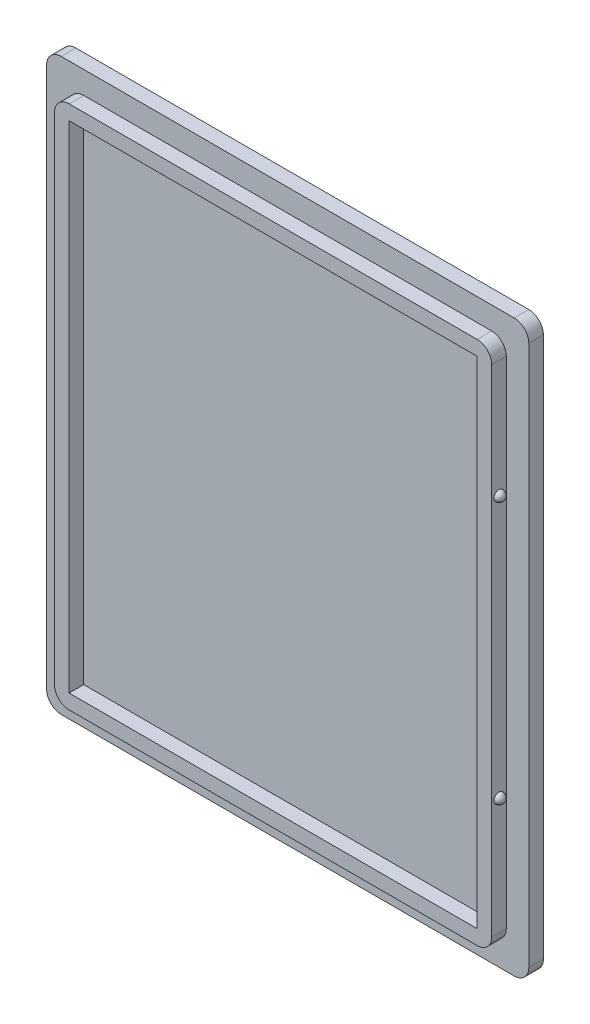
ISO-10303-21;
HEADER;
FILE_DESCRIPTION(('STEP AP214'),'2;1');
FILE_NAME('part.step','',(''),(''),'','','');
FILE_SCHEMA(('AUTOMOTIVE_DESIGN { 1 0 10303 214 1 1 1 1 }'));
ENDSEC;
DATA;
#1=APPLICATION_CONTEXT('core data for automotive mechanical design processes');
#2=APPLICATION_PROTOCOL_DEFINITION('international standard','automotive_design',2000,#1);
#3=PRODUCT_CONTEXT('',#1,'mechanical');
#4=PRODUCT('Part','Part','',(#3));
#5=PRODUCT_RELATED_PRODUCT_CATEGORY('part','',(#4));
#6=PRODUCT_DEFINITION_FORMATION('','',#4);
#7=PRODUCT_DEFINITION_CONTEXT('part definition',#1,'design');
#8=PRODUCT_DEFINITION('design','',#6,#7);
#9=PRODUCT_DEFINITION_SHAPE('','',#8);
#10=(LENGTH_UNIT() NAMED_UNIT(*) SI_UNIT(.MILLI.,.METRE.));
#11=(NAMED_UNIT(*) PLANE_ANGLE_UNIT() SI_UNIT($,.RADIAN.));
#12=(NAMED_UNIT(*) SI_UNIT($,.STERADIAN.) SOLID_ANGLE_UNIT());
#13=UNCERTAINTY_MEASURE_WITH_UNIT(LENGTH_MEASURE(1.E-05),#10,'distance_accuracy_value','');
#14=(GEOMETRIC_REPRESENTATION_CONTEXT(3) GLOBAL_UNCERTAINTY_ASSIGNED_CONTEXT((#13)) GLOBAL_UNIT_ASSIGNED_CONTEXT((#10,
#11,#12)) REPRESENTATION_CONTEXT('',''));
#15=CARTESIAN_POINT('',(0.,0.,0.));
#16=DIRECTION('',(0.,0.,1.));
#17=DIRECTION('',(1.,0.,0.));
#18=AXIS2_PLACEMENT_3D('',#15,#16,#17);
#19=CARTESIAN_POINT('',(0.,0.,1.));
#20=DIRECTION('',(0.,0.,1.));
#21=DIRECTION('',(1.,0.,0.));
#22=AXIS2_PLACEMENT_3D('',#19,#20,#21);
#23=PLANE('',#22);
#24=DIRECTION('',(1.,0.,0.));
#25=VECTOR('',#24,1.);
#26=CARTESIAN_POINT('',(-16.5,-19.5,1.));
#27=LINE('',#26,#25);
#28=CARTESIAN_POINT('',(-15.5,-19.5,1.));
#29=VERTEX_POINT('',#28);
#30=CARTESIAN_POINT('',(15.5,-19.5,1.));
#31=VERTEX_POINT('',#30);
#32=EDGE_CURVE('E277',#29,#31,#27,.T.);
#33=ORIENTED_EDGE('',*,*,#32,.T.);
#34=CARTESIAN_POINT('',(15.5,-18.5,1.));
#35=DIRECTION('',(0.,0.,1.));
#36=DIRECTION('',(1.,0.,0.));
#37=AXIS2_PLACEMENT_3D('',#34,#35,#36);
#38=CIRCLE('',#37,1.);
#39=CARTESIAN_POINT('',(16.5,-18.5,1.));
#40=VERTEX_POINT('',#39);
#41=EDGE_CURVE('E350',#31,#40,#38,.T.);
#42=ORIENTED_EDGE('',*,*,#41,.T.);
#43=DIRECTION('',(0.,1.,0.));
#44=VECTOR('',#43,1.);
#45=CARTESIAN_POINT('',(16.5,-19.5,1.));
#46=LINE('',#45,#44);
#47=CARTESIAN_POINT('',(16.5,18.5,1.));
#48=VERTEX_POINT('',#47);
#49=EDGE_CURVE('E281',#40,#48,#46,.T.);
#50=ORIENTED_EDGE('',*,*,#49,.T.);
#51=CARTESIAN_POINT('',(15.5,18.5,1.));
#52=DIRECTION('',(0.,0.,1.));
#53=DIRECTION('',(1.,0.,0.));
#54=AXIS2_PLACEMENT_3D('',#51,#52,#53);
#55=CIRCLE('',#54,1.);
#56=CARTESIAN_POINT('',(15.5,19.5,1.));
#57=VERTEX_POINT('',#56);
#58=EDGE_CURVE('E341',#48,#57,#55,.T.);
#59=ORIENTED_EDGE('',*,*,#58,.T.);
#60=DIRECTION('',(-1.,0.,0.));
#61=VECTOR('',#60,1.);
#62=CARTESIAN_POINT('',(-16.5,19.5,1.));
#63=LINE('',#62,#61);
#64=CARTESIAN_POINT('',(-15.5,19.5,1.));
#65=VERTEX_POINT('',#64);
#66=EDGE_CURVE('E268',#57,#65,#63,.T.);
#67=ORIENTED_EDGE('',*,*,#66,.T.);
#68=CARTESIAN_POINT('',(-15.5,18.5,1.));
#69=DIRECTION('',(0.,0.,1.));
#70=DIRECTION('',(1.,0.,0.));
#71=AXIS2_PLACEMENT_3D('',#68,#69,#70);
#72=CIRCLE('',#71,1.);
#73=CARTESIAN_POINT('',(-16.5,18.5,1.));
#74=VERTEX_POINT('',#73);
#75=EDGE_CURVE('E344',#65,#74,#72,.T.);
#76=ORIENTED_EDGE('',*,*,#75,.T.);
#77=DIRECTION('',(0.,-1.,0.));
#78=VECTOR('',#77,1.);
#79=CARTESIAN_POINT('',(-16.5,-19.5,1.));
#80=LINE('',#79,#78);
#81=CARTESIAN_POINT('',(-16.5,-18.5,1.));
#82=VERTEX_POINT('',#81);
#83=EDGE_CURVE('E272',#74,#82,#80,.T.);
#84=ORIENTED_EDGE('',*,*,#83,.T.);
#85=CARTESIAN_POINT('',(-15.5,-18.5,1.));
#86=DIRECTION('',(0.,0.,1.));
#87=DIRECTION('',(1.,0.,0.));
#88=AXIS2_PLACEMENT_3D('',#85,#86,#87);
#89=CIRCLE('',#88,1.);
#90=EDGE_CURVE('E347',#82,#29,#89,.T.);
#91=ORIENTED_EDGE('',*,*,#90,.T.);
#92=EDGE_LOOP('',(#33,#42,#50,#59,#67,#76,#84,#91));
#93=FACE_BOUND('',#92,.T.);
#94=DIRECTION('',(0.,-1.,0.));
#95=VECTOR('',#94,1.);
#96=CARTESIAN_POINT('',(-14.96,17.96,1.));
#97=LINE('',#96,#95);
#98=CARTESIAN_POINT('',(-14.96,16.96,1.));
#99=VERTEX_POINT('',#98);
#100=CARTESIAN_POINT('',(-14.96,-16.96,1.));
#101=VERTEX_POINT('',#100);
#102=EDGE_CURVE('E258',#99,#101,#97,.T.);
#103=ORIENTED_EDGE('',*,*,#102,.F.);
#104=CARTESIAN_POINT('',(-13.96,16.96,1.));
#105=DIRECTION('',(0.,0.,1.));
#106=DIRECTION('',(1.,0.,0.));
#107=AXIS2_PLACEMENT_3D('',#104,#105,#106);
#108=CIRCLE('',#107,1.);
#109=CARTESIAN_POINT('',(-13.96,17.96,1.));
#110=VERTEX_POINT('',#109);
#111=EDGE_CURVE('E409',#99,#110,#108,.F.);
#112=ORIENTED_EDGE('',*,*,#111,.T.);
#113=DIRECTION('',(-1.,0.,0.));
#114=VECTOR('',#113,1.);
#115=CARTESIAN_POINT('',(-14.96,17.96,1.));
#116=LINE('',#115,#114);
#117=CARTESIAN_POINT('',(13.96,17.96,1.));
#118=VERTEX_POINT('',#117);
#119=EDGE_CURVE('E204',#118,#110,#116,.T.);
#120=ORIENTED_EDGE('',*,*,#119,.F.);
#121=CARTESIAN_POINT('',(13.96,16.96,1.));
#122=DIRECTION('',(0.,0.,1.));
#123=DIRECTION('',(1.,0.,0.));
#124=AXIS2_PLACEMENT_3D('',#121,#122,#123);
#125=CIRCLE('',#124,1.);
#126=CARTESIAN_POINT('',(14.96,16.96,1.));
#127=VERTEX_POINT('',#126);
#128=EDGE_CURVE('E406',#118,#127,#125,.F.);
#129=ORIENTED_EDGE('',*,*,#128,.T.);
#130=DIRECTION('',(0.,1.,0.));
#131=VECTOR('',#130,1.);
#132=CARTESIAN_POINT('',(14.96,17.96,1.));
#133=LINE('',#132,#131);
#134=CARTESIAN_POINT('',(14.96,-16.96,1.));
#135=VERTEX_POINT('',#134);
#136=EDGE_CURVE('E242',#135,#127,#133,.T.);
#137=ORIENTED_EDGE('',*,*,#136,.F.);
#138=CARTESIAN_POINT('',(13.96,-16.96,1.));
#139=DIRECTION('',(0.,0.,1.));
#140=DIRECTION('',(1.,0.,0.));
#141=AXIS2_PLACEMENT_3D('',#138,#139,#140);
#142=CIRCLE('',#141,1.);
#143=CARTESIAN_POINT('',(13.96,-17.96,1.));
#144=VERTEX_POINT('',#143);
#145=EDGE_CURVE('E11',#135,#144,#142,.F.);
#146=ORIENTED_EDGE('',*,*,#145,.T.);
#147=DIRECTION('',(1.,0.,0.));
#148=VECTOR('',#147,1.);
#149=CARTESIAN_POINT('',(-14.96,-17.96,1.));
#150=LINE('',#149,#148);
#151=CARTESIAN_POINT('',(-13.96,-17.96,1.));
#152=VERTEX_POINT('',#151);
#153=EDGE_CURVE('E262',#152,#144,#150,.T.);
#154=ORIENTED_EDGE('',*,*,#153,.F.);
#155=CARTESIAN_POINT('',(-13.96,-16.96,1.));
#156=DIRECTION('',(0.,0.,1.));
#157=DIRECTION('',(1.,0.,0.));
#158=AXIS2_PLACEMENT_3D('',#155,#156,#157);
#159=CIRCLE('',#158,1.);
#160=EDGE_CURVE('E54',#152,#101,#159,.F.);
#161=ORIENTED_EDGE('',*,*,#160,.T.);
#162=EDGE_LOOP('',(#103,#112,#120,#129,#137,#146,#154,#161));
#163=FACE_BOUND('',#162,.T.);
#164=ADVANCED_FACE('F45',(#93,#163),#23,.T.);
#165=CARTESIAN_POINT('',(-16.5,19.5,1.));
#166=DIRECTION('',(0.,-1.,0.));
#167=DIRECTION('',(1.,0.,0.));
#168=AXIS2_PLACEMENT_3D('',#165,#166,#167);
#169=PLANE('',#168);
#170=DIRECTION('',(-1.,0.,0.));
#171=VECTOR('',#170,1.);
#172=CARTESIAN_POINT('',(-16.5,19.5,0.));
#173=LINE('',#172,#171);
#174=CARTESIAN_POINT('',(15.5,19.5,0.));
#175=VERTEX_POINT('',#174);
#176=CARTESIAN_POINT('',(-15.5,19.5,0.));
#177=VERTEX_POINT('',#176);
#178=EDGE_CURVE('E254',#175,#177,#173,.T.);
#179=ORIENTED_EDGE('',*,*,#178,.T.);
#180=DIRECTION('',(0.,0.,-1.));
#181=VECTOR('',#180,1.);
#182=CARTESIAN_POINT('',(-15.5,19.5,1.));
#183=LINE('',#182,#181);
#184=EDGE_CURVE('E364',#177,#65,#183,.F.);
#185=ORIENTED_EDGE('',*,*,#184,.T.);
#186=ORIENTED_EDGE('',*,*,#66,.F.);
#187=DIRECTION('',(0.,0.,-1.));
#188=VECTOR('',#187,1.);
#189=CARTESIAN_POINT('',(15.5,19.5,1.));
#190=LINE('',#189,#188);
#191=EDGE_CURVE('E360',#57,#175,#190,.T.);
#192=ORIENTED_EDGE('',*,*,#191,.T.);
#193=EDGE_LOOP('',(#179,#185,#186,#192));
#194=FACE_BOUND('',#193,.T.);
#195=ADVANCED_FACE('F452',(#194),#169,.F.);
#196=CARTESIAN_POINT('',(-16.5,-19.5,1.));
#197=DIRECTION('',(1.,0.,0.));
#198=DIRECTION('',(0.,0.,-1.));
#199=AXIS2_PLACEMENT_3D('',#196,#197,#198);
#200=PLANE('',#199);
#201=DIRECTION('',(0.,-1.,0.));
#202=VECTOR('',#201,1.);
#203=CARTESIAN_POINT('',(-16.5,-19.5,0.));
#204=LINE('',#203,#202);
#205=CARTESIAN_POINT('',(-16.5,18.5,0.));
#206=VERTEX_POINT('',#205);
#207=CARTESIAN_POINT('',(-16.5,-18.5,0.));
#208=VERTEX_POINT('',#207);
#209=EDGE_CURVE('E289',#206,#208,#204,.T.);
#210=ORIENTED_EDGE('',*,*,#209,.T.);
#211=DIRECTION('',(0.,0.,-1.));
#212=VECTOR('',#211,1.);
#213=CARTESIAN_POINT('',(-16.5,-18.5,1.));
#214=LINE('',#213,#212);
#215=EDGE_CURVE('E357',#208,#82,#214,.F.);
#216=ORIENTED_EDGE('',*,*,#215,.T.);
#217=ORIENTED_EDGE('',*,*,#83,.F.);
#218=DIRECTION('',(0.,0.,-1.));
#219=VECTOR('',#218,1.);
#220=CARTESIAN_POINT('',(-16.5,18.5,1.));
#221=LINE('',#220,#219);
#222=EDGE_CURVE('E353',#74,#206,#221,.T.);
#223=ORIENTED_EDGE('',*,*,#222,.T.);
#224=EDGE_LOOP('',(#210,#216,#217,#223));
#225=FACE_BOUND('',#224,.T.);
#226=ADVANCED_FACE('F461',(#225),#200,.F.);
#227=CARTESIAN_POINT('',(-16.5,-19.5,1.));
#228=DIRECTION('',(0.,1.,0.));
#229=DIRECTION('',(-1.,0.,0.));
#230=AXIS2_PLACEMENT_3D('',#227,#228,#229);
#231=PLANE('',#230);
#232=DIRECTION('',(1.,0.,0.));
#233=VECTOR('',#232,1.);
#234=CARTESIAN_POINT('',(-16.5,-19.5,0.));
#235=LINE('',#234,#233);
#236=CARTESIAN_POINT('',(-15.5,-19.5,0.));
#237=VERTEX_POINT('',#236);
#238=CARTESIAN_POINT('',(15.5,-19.5,0.));
#239=VERTEX_POINT('',#238);
#240=EDGE_CURVE('E293',#237,#239,#235,.T.);
#241=ORIENTED_EDGE('',*,*,#240,.T.);
#242=DIRECTION('',(0.,0.,-1.));
#243=VECTOR('',#242,1.);
#244=CARTESIAN_POINT('',(15.5,-19.5,1.));
#245=LINE('',#244,#243);
#246=EDGE_CURVE('E338',#239,#31,#245,.F.);
#247=ORIENTED_EDGE('',*,*,#246,.T.);
#248=ORIENTED_EDGE('',*,*,#32,.F.);
#249=DIRECTION('',(0.,0.,-1.));
#250=VECTOR('',#249,1.);
#251=CARTESIAN_POINT('',(-15.5,-19.5,1.));
#252=LINE('',#251,#250);
#253=EDGE_CURVE('E334',#29,#237,#252,.T.);
#254=ORIENTED_EDGE('',*,*,#253,.T.);
#255=EDGE_LOOP('',(#241,#247,#248,#254));
#256=FACE_BOUND('',#255,.T.);
#257=ADVANCED_FACE('F671',(#256),#231,.F.);
#258=CARTESIAN_POINT('',(16.5,-19.5,1.));
#259=DIRECTION('',(-1.,0.,0.));
#260=DIRECTION('',(0.,0.,1.));
#261=AXIS2_PLACEMENT_3D('',#258,#259,#260);
#262=PLANE('',#261);
#263=ORIENTED_EDGE('',*,*,#49,.F.);
#264=DIRECTION('',(0.,0.,-1.));
#265=VECTOR('',#264,1.);
#266=CARTESIAN_POINT('',(16.5,-18.5,1.));
#267=LINE('',#266,#265);
#268=CARTESIAN_POINT('',(16.5,-18.5,0.));
#269=VERTEX_POINT('',#268);
#270=EDGE_CURVE('E318',#40,#269,#267,.T.);
#271=ORIENTED_EDGE('',*,*,#270,.T.);
#272=DIRECTION('',(0.,1.,0.));
#273=VECTOR('',#272,1.);
#274=CARTESIAN_POINT('',(16.5,-19.5,0.));
#275=LINE('',#274,#273);
#276=CARTESIAN_POINT('',(16.5,18.5,0.));
#277=VERTEX_POINT('',#276);
#278=EDGE_CURVE('E273',#269,#277,#275,.T.);
#279=ORIENTED_EDGE('',*,*,#278,.T.);
#280=DIRECTION('',(0.,0.,-1.));
#281=VECTOR('',#280,1.);
#282=CARTESIAN_POINT('',(16.5,18.5,1.));
#283=LINE('',#282,#281);
#284=EDGE_CURVE('E315',#277,#48,#283,.F.);
#285=ORIENTED_EDGE('',*,*,#284,.T.);
#286=EDGE_LOOP('',(#263,#271,#279,#285));
#287=FACE_BOUND('',#286,.T.);
#288=ADVANCED_FACE('F659',(#287),#262,.F.);
#289=CARTESIAN_POINT('',(0.,0.,0.));
#290=DIRECTION('',(0.,0.,1.));
#291=DIRECTION('',(1.,0.,0.));
#292=AXIS2_PLACEMENT_3D('',#289,#290,#291);
#293=PLANE('',#292);
#294=ORIENTED_EDGE('',*,*,#278,.F.);
#295=CARTESIAN_POINT('',(15.5,-18.5,0.));
#296=DIRECTION('',(0.,0.,1.));
#297=DIRECTION('',(1.,0.,0.));
#298=AXIS2_PLACEMENT_3D('',#295,#296,#297);
#299=CIRCLE('',#298,1.);
#300=EDGE_CURVE('E331',#269,#239,#299,.F.);
#301=ORIENTED_EDGE('',*,*,#300,.T.);
#302=ORIENTED_EDGE('',*,*,#240,.F.);
#303=CARTESIAN_POINT('',(-15.5,-18.5,0.));
#304=DIRECTION('',(0.,0.,1.));
#305=DIRECTION('',(1.,0.,0.));
#306=AXIS2_PLACEMENT_3D('',#303,#304,#305);
#307=CIRCLE('',#306,1.);
#308=EDGE_CURVE('E328',#237,#208,#307,.F.);
#309=ORIENTED_EDGE('',*,*,#308,.T.);
#310=ORIENTED_EDGE('',*,*,#209,.F.);
#311=CARTESIAN_POINT('',(-15.5,18.5,0.));
#312=DIRECTION('',(0.,0.,1.));
#313=DIRECTION('',(1.,0.,0.));
#314=AXIS2_PLACEMENT_3D('',#311,#312,#313);
#315=CIRCLE('',#314,1.);
#316=EDGE_CURVE('E325',#206,#177,#315,.F.);
#317=ORIENTED_EDGE('',*,*,#316,.T.);
#318=ORIENTED_EDGE('',*,*,#178,.F.);
#319=CARTESIAN_POINT('',(15.5,18.5,0.));
#320=DIRECTION('',(0.,0.,1.));
#321=DIRECTION('',(1.,0.,0.));
#322=AXIS2_PLACEMENT_3D('',#319,#320,#321);
#323=CIRCLE('',#322,1.);
#324=EDGE_CURVE('E322',#175,#277,#323,.F.);
#325=ORIENTED_EDGE('',*,*,#324,.T.);
#326=EDGE_LOOP('',(#294,#301,#302,#309,#310,#317,#318,#325));
#327=FACE_BOUND('',#326,.T.);
#328=ADVANCED_FACE('F493',(#327),#293,.F.);
#329=CARTESIAN_POINT('',(0.,0.,2.));
#330=DIRECTION('',(0.,0.,-1.));
#331=DIRECTION('',(-1.,0.,0.));
#332=AXIS2_PLACEMENT_3D('',#329,#330,#331);
#333=PLANE('',#332);
#334=DIRECTION('',(0.,1.,0.));
#335=VECTOR('',#334,1.);
#336=CARTESIAN_POINT('',(14.96,17.96,2.));
#337=LINE('',#336,#335);
#338=CARTESIAN_POINT('',(14.96,-16.96,2.));
#339=VERTEX_POINT('',#338);
#340=CARTESIAN_POINT('',(14.96,16.96,2.));
#341=VERTEX_POINT('',#340);
#342=EDGE_CURVE('E250',#339,#341,#337,.T.);
#343=ORIENTED_EDGE('',*,*,#342,.T.);
#344=CARTESIAN_POINT('',(13.96,16.96,2.));
#345=DIRECTION('',(0.,0.,-1.));
#346=DIRECTION('',(-1.,0.,0.));
#347=AXIS2_PLACEMENT_3D('',#344,#345,#346);
#348=CIRCLE('',#347,1.);
#349=CARTESIAN_POINT('',(13.96,17.96,2.));
#350=VERTEX_POINT('',#349);
#351=EDGE_CURVE('E390',#341,#350,#348,.F.);
#352=ORIENTED_EDGE('',*,*,#351,.T.);
#353=DIRECTION('',(-1.,0.,0.));
#354=VECTOR('',#353,1.);
#355=CARTESIAN_POINT('',(-14.96,17.96,2.));
#356=LINE('',#355,#354);
#357=CARTESIAN_POINT('',(-13.96,17.96,2.));
#358=VERTEX_POINT('',#357);
#359=EDGE_CURVE('E237',#350,#358,#356,.T.);
#360=ORIENTED_EDGE('',*,*,#359,.T.);
#361=CARTESIAN_POINT('',(-13.96,16.96,2.));
#362=DIRECTION('',(0.,0.,-1.));
#363=DIRECTION('',(-1.,0.,0.));
#364=AXIS2_PLACEMENT_3D('',#361,#362,#363);
#365=CIRCLE('',#364,1.);
#366=CARTESIAN_POINT('',(-14.96,16.96,2.));
#367=VERTEX_POINT('',#366);
#368=EDGE_CURVE('E387',#358,#367,#365,.F.);
#369=ORIENTED_EDGE('',*,*,#368,.T.);
#370=DIRECTION('',(0.,-1.,0.));
#371=VECTOR('',#370,1.);
#372=CARTESIAN_POINT('',(-14.96,17.96,2.));
#373=LINE('',#372,#371);
#374=CARTESIAN_POINT('',(-14.96,-16.96,2.));
#375=VERTEX_POINT('',#374);
#376=EDGE_CURVE('E241',#367,#375,#373,.T.);
#377=ORIENTED_EDGE('',*,*,#376,.T.);
#378=CARTESIAN_POINT('',(-13.96,-16.96,2.));
#379=DIRECTION('',(0.,0.,-1.));
#380=DIRECTION('',(-1.,0.,0.));
#381=AXIS2_PLACEMENT_3D('',#378,#379,#380);
#382=CIRCLE('',#381,1.);
#383=CARTESIAN_POINT('',(-13.96,-17.96,2.));
#384=VERTEX_POINT('',#383);
#385=EDGE_CURVE('E384',#375,#384,#382,.F.);
#386=ORIENTED_EDGE('',*,*,#385,.T.);
#387=DIRECTION('',(1.,0.,0.));
#388=VECTOR('',#387,1.);
#389=CARTESIAN_POINT('',(-14.96,-17.96,2.));
#390=LINE('',#389,#388);
#391=CARTESIAN_POINT('',(13.96,-17.96,2.));
#392=VERTEX_POINT('',#391);
#393=EDGE_CURVE('E246',#384,#392,#390,.T.);
#394=ORIENTED_EDGE('',*,*,#393,.T.);
#395=CARTESIAN_POINT('',(13.96,-16.96,2.));
#396=DIRECTION('',(0.,0.,-1.));
#397=DIRECTION('',(-1.,0.,0.));
#398=AXIS2_PLACEMENT_3D('',#395,#396,#397);
#399=CIRCLE('',#398,1.);
#400=EDGE_CURVE('E381',#392,#339,#399,.F.);
#401=ORIENTED_EDGE('',*,*,#400,.T.);
#402=EDGE_LOOP('',(#343,#352,#360,#369,#377,#386,#394,#401));
#403=FACE_BOUND('',#402,.T.);
#404=DIRECTION('',(-1.,0.,0.));
#405=VECTOR('',#404,1.);
#406=CARTESIAN_POINT('',(-13.96,16.96,2.));
#407=LINE('',#406,#405);
#408=CARTESIAN_POINT('',(13.96,16.96,2.));
#409=VERTEX_POINT('',#408);
#410=CARTESIAN_POINT('',(-13.96,16.96,2.));
#411=VERTEX_POINT('',#410);
#412=EDGE_CURVE('E183',#409,#411,#407,.T.);
#413=ORIENTED_EDGE('',*,*,#412,.F.);
#414=DIRECTION('',(0.,1.,0.));
#415=VECTOR('',#414,1.);
#416=CARTESIAN_POINT('',(13.96,16.96,2.));
#417=LINE('',#416,#415);
#418=CARTESIAN_POINT('',(13.96,-16.96,2.));
#419=VERTEX_POINT('',#418);
#420=EDGE_CURVE('E214',#419,#409,#417,.T.);
#421=ORIENTED_EDGE('',*,*,#420,.F.);
#422=DIRECTION('',(1.,0.,0.));
#423=VECTOR('',#422,1.);
#424=CARTESIAN_POINT('',(-13.96,-16.96,2.));
#425=LINE('',#424,#423);
#426=CARTESIAN_POINT('',(-13.96,-16.96,2.));
#427=VERTEX_POINT('',#426);
#428=EDGE_CURVE('E210',#427,#419,#425,.T.);
#429=ORIENTED_EDGE('',*,*,#428,.F.);
#430=DIRECTION('',(0.,-1.,0.));
#431=VECTOR('',#430,1.);
#432=CARTESIAN_POINT('',(-13.96,16.96,2.));
#433=LINE('',#432,#431);
#434=EDGE_CURVE('E194',#411,#427,#433,.T.);
#435=ORIENTED_EDGE('',*,*,#434,.F.);
#436=EDGE_LOOP('',(#413,#421,#429,#435));
#437=FACE_BOUND('',#436,.T.);
#438=ADVANCED_FACE('F208',(#403,#437),#333,.F.);
#439=CARTESIAN_POINT('',(-14.96,17.96,2.));
#440=DIRECTION('',(0.,-1.,0.));
#441=DIRECTION('',(1.,0.,0.));
#442=AXIS2_PLACEMENT_3D('',#439,#440,#441);
#443=PLANE('',#442);
#444=ORIENTED_EDGE('',*,*,#359,.F.);
#445=DIRECTION('',(0.,0.,-1.));
#446=VECTOR('',#445,1.);
#447=CARTESIAN_POINT('',(13.96,17.96,2.));
#448=LINE('',#447,#446);
#449=EDGE_CURVE('E370',#350,#118,#448,.T.);
#450=ORIENTED_EDGE('',*,*,#449,.T.);
#451=ORIENTED_EDGE('',*,*,#119,.T.);
#452=DIRECTION('',(0.,0.,-1.));
#453=VECTOR('',#452,1.);
#454=CARTESIAN_POINT('',(-13.96,17.96,2.));
#455=LINE('',#454,#453);
#456=EDGE_CURVE('E367',#110,#358,#455,.F.);
#457=ORIENTED_EDGE('',*,*,#456,.T.);
#458=EDGE_LOOP('',(#444,#450,#451,#457));
#459=FACE_BOUND('',#458,.T.);
#460=ADVANCED_FACE('F438',(#459),#443,.F.);
#461=CARTESIAN_POINT('',(-14.96,17.96,2.));
#462=DIRECTION('',(1.,0.,0.));
#463=DIRECTION('',(0.,0.,-1.));
#464=AXIS2_PLACEMENT_3D('',#461,#462,#463);
#465=PLANE('',#464);
#466=CARTESIAN_POINT('',(-14.96,8.96000000000001,1.5));
#467=DIRECTION('',(1.,0.,0.));
#468=DIRECTION('',(0.,0.,-1.));
#469=AXIS2_PLACEMENT_3D('',#466,#467,#468);
#470=CIRCLE('',#469,0.35);
#471=CARTESIAN_POINT('',(-14.96,8.96000000000001,1.15));
#472=VERTEX_POINT('',#471);
#473=EDGE_CURVE('E311',#472,#472,#470,.F.);
#474=ORIENTED_EDGE('',*,*,#473,.F.);
#475=EDGE_LOOP('',(#474));
#476=FACE_BOUND('',#475,.T.);
#477=CARTESIAN_POINT('',(-14.96,-8.96000000000001,1.5));
#478=DIRECTION('',(1.,0.,0.));
#479=DIRECTION('',(0.,0.,-1.));
#480=AXIS2_PLACEMENT_3D('',#477,#478,#479);
#481=CIRCLE('',#480,0.35);
#482=CARTESIAN_POINT('',(-14.96,-8.96000000000001,1.15));
#483=VERTEX_POINT('',#482);
#484=EDGE_CURVE('E307',#483,#483,#481,.F.);
#485=ORIENTED_EDGE('',*,*,#484,.F.);
#486=EDGE_LOOP('',(#485));
#487=FACE_BOUND('',#486,.T.);
#488=ORIENTED_EDGE('',*,*,#376,.F.);
#489=DIRECTION('',(0.,0.,-1.));
#490=VECTOR('',#489,1.);
#491=CARTESIAN_POINT('',(-14.96,16.96,2.));
#492=LINE('',#491,#490);
#493=EDGE_CURVE('E396',#367,#99,#492,.T.);
#494=ORIENTED_EDGE('',*,*,#493,.T.);
#495=ORIENTED_EDGE('',*,*,#102,.T.);
#496=DIRECTION('',(0.,0.,-1.));
#497=VECTOR('',#496,1.);
#498=CARTESIAN_POINT('',(-14.96,-16.96,2.));
#499=LINE('',#498,#497);
#500=EDGE_CURVE('E393',#101,#375,#499,.F.);
#501=ORIENTED_EDGE('',*,*,#500,.T.);
#502=EDGE_LOOP('',(#488,#494,#495,#501));
#503=FACE_BOUND('',#502,.T.);
#504=ADVANCED_FACE('F415',(#476,#487,#503),#465,.F.);
#505=CARTESIAN_POINT('',(-14.96,-17.96,2.));
#506=DIRECTION('',(0.,1.,0.));
#507=DIRECTION('',(0.,0.,1.));
#508=AXIS2_PLACEMENT_3D('',#505,#506,#507);
#509=PLANE('',#508);
#510=ORIENTED_EDGE('',*,*,#393,.F.);
#511=DIRECTION('',(0.,0.,-1.));
#512=VECTOR('',#511,1.);
#513=CARTESIAN_POINT('',(-13.96,-17.96,2.));
#514=LINE('',#513,#512);
#515=EDGE_CURVE('E403',#384,#152,#514,.T.);
#516=ORIENTED_EDGE('',*,*,#515,.T.);
#517=ORIENTED_EDGE('',*,*,#153,.T.);
#518=DIRECTION('',(0.,0.,-1.));
#519=VECTOR('',#518,1.);
#520=CARTESIAN_POINT('',(13.96,-17.96,2.));
#521=LINE('',#520,#519);
#522=EDGE_CURVE('E400',#144,#392,#521,.F.);
#523=ORIENTED_EDGE('',*,*,#522,.T.);
#524=EDGE_LOOP('',(#510,#516,#517,#523));
#525=FACE_BOUND('',#524,.T.);
#526=ADVANCED_FACE('F423',(#525),#509,.F.);
#527=CARTESIAN_POINT('',(14.96,17.96,2.));
#528=DIRECTION('',(-1.,0.,0.));
#529=DIRECTION('',(0.,-1.,0.));
#530=AXIS2_PLACEMENT_3D('',#527,#528,#529);
#531=PLANE('',#530);
#532=CARTESIAN_POINT('',(14.96,8.96000000000001,1.5));
#533=DIRECTION('',(-1.,0.,0.));
#534=DIRECTION('',(0.,-1.,0.));
#535=AXIS2_PLACEMENT_3D('',#532,#533,#534);
#536=CIRCLE('',#535,0.35);
#537=CARTESIAN_POINT('',(14.96,8.61000000000001,1.5));
#538=VERTEX_POINT('',#537);
#539=EDGE_CURVE('E303',#538,#538,#536,.F.);
#540=ORIENTED_EDGE('',*,*,#539,.F.);
#541=EDGE_LOOP('',(#540));
#542=FACE_BOUND('',#541,.T.);
#543=CARTESIAN_POINT('',(14.96,-8.96000000000001,1.5));
#544=DIRECTION('',(-1.,0.,0.));
#545=DIRECTION('',(0.,-1.,0.));
#546=AXIS2_PLACEMENT_3D('',#543,#544,#545);
#547=CIRCLE('',#546,0.35);
#548=CARTESIAN_POINT('',(14.96,-9.31000000000001,1.5));
#549=VERTEX_POINT('',#548);
#550=EDGE_CURVE('E285',#549,#549,#547,.F.);
#551=ORIENTED_EDGE('',*,*,#550,.F.);
#552=EDGE_LOOP('',(#551));
#553=FACE_BOUND('',#552,.T.);
#554=ORIENTED_EDGE('',*,*,#136,.T.);
#555=DIRECTION('',(0.,0.,-1.));
#556=VECTOR('',#555,1.);
#557=CARTESIAN_POINT('',(14.96,16.96,2.));
#558=LINE('',#557,#556);
#559=EDGE_CURVE('E378',#127,#341,#558,.F.);
#560=ORIENTED_EDGE('',*,*,#559,.T.);
#561=ORIENTED_EDGE('',*,*,#342,.F.);
#562=DIRECTION('',(0.,0.,-1.));
#563=VECTOR('',#562,1.);
#564=CARTESIAN_POINT('',(14.96,-16.96,2.));
#565=LINE('',#564,#563);
#566=EDGE_CURVE('E374',#339,#135,#565,.T.);
#567=ORIENTED_EDGE('',*,*,#566,.T.);
#568=EDGE_LOOP('',(#554,#560,#561,#567));
#569=FACE_BOUND('',#568,.T.);
#570=ADVANCED_FACE('F430',(#542,#553,#569),#531,.F.);
#571=CARTESIAN_POINT('',(-13.96,16.96,2.));
#572=DIRECTION('',(0.,-1.,0.));
#573=DIRECTION('',(1.,0.,0.));
#574=AXIS2_PLACEMENT_3D('',#571,#572,#573);
#575=PLANE('',#574);
#576=DIRECTION('',(-1.,0.,0.));
#577=VECTOR('',#576,1.);
#578=CARTESIAN_POINT('',(-13.96,16.96,1.));
#579=LINE('',#578,#577);
#580=CARTESIAN_POINT('',(13.96,16.96,1.));
#581=VERTEX_POINT('',#580);
#582=CARTESIAN_POINT('',(-13.96,16.96,1.));
#583=VERTEX_POINT('',#582);
#584=EDGE_CURVE('E219',#581,#583,#579,.T.);
#585=ORIENTED_EDGE('',*,*,#584,.F.);
#586=DIRECTION('',(0.,0.,-1.));
#587=VECTOR('',#586,1.);
#588=CARTESIAN_POINT('',(13.96,16.96,2.));
#589=LINE('',#588,#587);
#590=EDGE_CURVE('E189',#409,#581,#589,.T.);
#591=ORIENTED_EDGE('',*,*,#590,.F.);
#592=ORIENTED_EDGE('',*,*,#412,.T.);
#593=DIRECTION('',(0.,0.,-1.));
#594=VECTOR('',#593,1.);
#595=CARTESIAN_POINT('',(-13.96,16.96,2.));
#596=LINE('',#595,#594);
#597=EDGE_CURVE('E187',#411,#583,#596,.T.);
#598=ORIENTED_EDGE('',*,*,#597,.T.);
#599=EDGE_LOOP('',(#585,#591,#592,#598));
#600=FACE_BOUND('',#599,.T.);
#601=ADVANCED_FACE('F186',(#600),#575,.T.);
#602=CARTESIAN_POINT('',(-13.96,16.96,2.));
#603=DIRECTION('',(1.,0.,0.));
#604=DIRECTION('',(0.,0.,-1.));
#605=AXIS2_PLACEMENT_3D('',#602,#603,#604);
#606=PLANE('',#605);
#607=DIRECTION('',(0.,-1.,0.));
#608=VECTOR('',#607,1.);
#609=CARTESIAN_POINT('',(-13.96,16.96,1.));
#610=LINE('',#609,#608);
#611=CARTESIAN_POINT('',(-13.96,-16.96,1.));
#612=VERTEX_POINT('',#611);
#613=EDGE_CURVE('E202',#583,#612,#610,.T.);
#614=ORIENTED_EDGE('',*,*,#613,.F.);
#615=ORIENTED_EDGE('',*,*,#597,.F.);
#616=ORIENTED_EDGE('',*,*,#434,.T.);
#617=DIRECTION('',(0.,0.,-1.));
#618=VECTOR('',#617,1.);
#619=CARTESIAN_POINT('',(-13.96,-16.96,2.));
#620=LINE('',#619,#618);
#621=EDGE_CURVE('E205',#427,#612,#620,.T.);
#622=ORIENTED_EDGE('',*,*,#621,.T.);
#623=EDGE_LOOP('',(#614,#615,#616,#622));
#624=FACE_BOUND('',#623,.T.);
#625=ADVANCED_FACE('F199',(#624),#606,.T.);
#626=CARTESIAN_POINT('',(-13.96,-16.96,2.));
#627=DIRECTION('',(0.,1.,0.));
#628=DIRECTION('',(0.,0.,1.));
#629=AXIS2_PLACEMENT_3D('',#626,#627,#628);
#630=PLANE('',#629);
#631=DIRECTION('',(1.,0.,0.));
#632=VECTOR('',#631,1.);
#633=CARTESIAN_POINT('',(-13.96,-16.96,1.));
#634=LINE('',#633,#632);
#635=CARTESIAN_POINT('',(13.96,-16.96,1.));
#636=VERTEX_POINT('',#635);
#637=EDGE_CURVE('E224',#612,#636,#634,.T.);
#638=ORIENTED_EDGE('',*,*,#637,.F.);
#639=ORIENTED_EDGE('',*,*,#621,.F.);
#640=ORIENTED_EDGE('',*,*,#428,.T.);
#641=DIRECTION('',(0.,0.,-1.));
#642=VECTOR('',#641,1.);
#643=CARTESIAN_POINT('',(13.96,-16.96,2.));
#644=LINE('',#643,#642);
#645=EDGE_CURVE('E231',#419,#636,#644,.T.);
#646=ORIENTED_EDGE('',*,*,#645,.T.);
#647=EDGE_LOOP('',(#638,#639,#640,#646));
#648=FACE_BOUND('',#647,.T.);
#649=ADVANCED_FACE('F477',(#648),#630,.T.);
#650=CARTESIAN_POINT('',(13.96,16.96,2.));
#651=DIRECTION('',(-1.,0.,0.));
#652=DIRECTION('',(0.,-1.,0.));
#653=AXIS2_PLACEMENT_3D('',#650,#651,#652);
#654=PLANE('',#653);
#655=DIRECTION('',(0.,1.,0.));
#656=VECTOR('',#655,1.);
#657=CARTESIAN_POINT('',(13.96,16.96,1.));
#658=LINE('',#657,#656);
#659=EDGE_CURVE('E195',#636,#581,#658,.T.);
#660=ORIENTED_EDGE('',*,*,#659,.F.);
#661=ORIENTED_EDGE('',*,*,#645,.F.);
#662=ORIENTED_EDGE('',*,*,#420,.T.);
#663=ORIENTED_EDGE('',*,*,#590,.T.);
#664=EDGE_LOOP('',(#660,#661,#662,#663));
#665=FACE_BOUND('',#664,.T.);
#666=ADVANCED_FACE('F468',(#665),#654,.T.);
#667=ORIENTED_EDGE('',*,*,#584,.T.);
#668=ORIENTED_EDGE('',*,*,#613,.T.);
#669=ORIENTED_EDGE('',*,*,#637,.T.);
#670=ORIENTED_EDGE('',*,*,#659,.T.);
#671=EDGE_LOOP('',(#667,#668,#669,#670));
#672=FACE_BOUND('',#671,.T.);
#673=ADVANCED_FACE('F455',(#672),#23,.T.);
#674=CARTESIAN_POINT('',(14.96,-8.96000000000001,1.5));
#675=DIRECTION('',(0.,-1.,0.));
#676=DIRECTION('',(0.,0.,1.));
#677=AXIS2_PLACEMENT_3D('',#674,#675,#676);
#678=SPHERICAL_SURFACE('',#677,0.35);
#679=CARTESIAN_POINT('',(14.96,-8.96000000000001,1.5));
#680=DIRECTION('',(-1.,0.,0.));
#681=DIRECTION('',(0.,-1.,0.));
#682=AXIS2_PLACEMENT_3D('',#679,#680,#681);
#683=SPHERICAL_SURFACE('',#682,0.35);
#684=ORIENTED_EDGE('',*,*,#550,.T.);
#685=EDGE_LOOP('',(#684));
#686=FACE_BOUND('',#685,.T.);
#687=ADVANCED_FACE('F467',(#686),#683,.T.);
#688=CARTESIAN_POINT('',(14.96,8.96000000000001,1.5));
#689=DIRECTION('',(0.,1.,0.));
#690=DIRECTION('',(0.,0.,1.));
#691=AXIS2_PLACEMENT_3D('',#688,#689,#690);
#692=SPHERICAL_SURFACE('',#691,0.35);
#693=CARTESIAN_POINT('',(14.96,8.96000000000001,1.5));
#694=DIRECTION('',(-1.,0.,0.));
#695=DIRECTION('',(0.,-1.,0.));
#696=AXIS2_PLACEMENT_3D('',#693,#694,#695);
#697=SPHERICAL_SURFACE('',#696,0.35);
#698=ORIENTED_EDGE('',*,*,#539,.T.);
#699=EDGE_LOOP('',(#698));
#700=FACE_BOUND('',#699,.T.);
#701=ADVANCED_FACE('F474',(#700),#697,.T.);
#702=CARTESIAN_POINT('',(-14.96,-8.96000000000001,1.5));
#703=DIRECTION('',(0.,-1.,0.));
#704=DIRECTION('',(0.,0.,1.));
#705=AXIS2_PLACEMENT_3D('',#702,#703,#704);
#706=SPHERICAL_SURFACE('',#705,0.35);
#707=CARTESIAN_POINT('',(-14.96,-8.96000000000001,1.5));
#708=DIRECTION('',(1.,0.,0.));
#709=DIRECTION('',(0.,0.,-1.));
#710=AXIS2_PLACEMENT_3D('',#707,#708,#709);
#711=SPHERICAL_SURFACE('',#710,0.35);
#712=ORIENTED_EDGE('',*,*,#484,.T.);
#713=EDGE_LOOP('',(#712));
#714=FACE_BOUND('',#713,.T.);
#715=ADVANCED_FACE('F594',(#714),#711,.T.);
#716=CARTESIAN_POINT('',(-14.96,8.96000000000001,1.5));
#717=DIRECTION('',(0.,1.,0.));
#718=DIRECTION('',(0.,0.,1.));
#719=AXIS2_PLACEMENT_3D('',#716,#717,#718);
#720=SPHERICAL_SURFACE('',#719,0.35);
#721=CARTESIAN_POINT('',(-14.96,8.96000000000001,1.5));
#722=DIRECTION('',(1.,0.,0.));
#723=DIRECTION('',(0.,0.,-1.));
#724=AXIS2_PLACEMENT_3D('',#721,#722,#723);
#725=SPHERICAL_SURFACE('',#724,0.35);
#726=ORIENTED_EDGE('',*,*,#473,.T.);
#727=EDGE_LOOP('',(#726));
#728=FACE_BOUND('',#727,.T.);
#729=ADVANCED_FACE('F583',(#728),#725,.T.);
#730=CARTESIAN_POINT('',(15.5,-18.5,1.));
#731=DIRECTION('',(0.,0.,-1.));
#732=DIRECTION('',(-1.,0.,0.));
#733=AXIS2_PLACEMENT_3D('',#730,#731,#732);
#734=CYLINDRICAL_SURFACE('',#733,1.);
#735=ORIENTED_EDGE('',*,*,#41,.F.);
#736=ORIENTED_EDGE('',*,*,#246,.F.);
#737=ORIENTED_EDGE('',*,*,#300,.F.);
#738=ORIENTED_EDGE('',*,*,#270,.F.);
#739=EDGE_LOOP('',(#735,#736,#737,#738));
#740=FACE_BOUND('',#739,.T.);
#741=ADVANCED_FACE('F573',(#740),#734,.T.);
#742=CARTESIAN_POINT('',(-15.5,-18.5,1.));
#743=DIRECTION('',(0.,0.,-1.));
#744=DIRECTION('',(-1.,0.,0.));
#745=AXIS2_PLACEMENT_3D('',#742,#743,#744);
#746=CYLINDRICAL_SURFACE('',#745,1.);
#747=ORIENTED_EDGE('',*,*,#90,.F.);
#748=ORIENTED_EDGE('',*,*,#215,.F.);
#749=ORIENTED_EDGE('',*,*,#308,.F.);
#750=ORIENTED_EDGE('',*,*,#253,.F.);
#751=EDGE_LOOP('',(#747,#748,#749,#750));
#752=FACE_BOUND('',#751,.T.);
#753=ADVANCED_FACE('F563',(#752),#746,.T.);
#754=CARTESIAN_POINT('',(-15.5,18.5,1.));
#755=DIRECTION('',(0.,0.,-1.));
#756=DIRECTION('',(-1.,0.,0.));
#757=AXIS2_PLACEMENT_3D('',#754,#755,#756);
#758=CYLINDRICAL_SURFACE('',#757,1.);
#759=ORIENTED_EDGE('',*,*,#75,.F.);
#760=ORIENTED_EDGE('',*,*,#184,.F.);
#761=ORIENTED_EDGE('',*,*,#316,.F.);
#762=ORIENTED_EDGE('',*,*,#222,.F.);
#763=EDGE_LOOP('',(#759,#760,#761,#762));
#764=FACE_BOUND('',#763,.T.);
#765=ADVANCED_FACE('F553',(#764),#758,.T.);
#766=CARTESIAN_POINT('',(15.5,18.5,1.));
#767=DIRECTION('',(0.,0.,-1.));
#768=DIRECTION('',(-1.,0.,0.));
#769=AXIS2_PLACEMENT_3D('',#766,#767,#768);
#770=CYLINDRICAL_SURFACE('',#769,1.);
#771=ORIENTED_EDGE('',*,*,#58,.F.);
#772=ORIENTED_EDGE('',*,*,#284,.F.);
#773=ORIENTED_EDGE('',*,*,#324,.F.);
#774=ORIENTED_EDGE('',*,*,#191,.F.);
#775=EDGE_LOOP('',(#771,#772,#773,#774));
#776=FACE_BOUND('',#775,.T.);
#777=ADVANCED_FACE('F449',(#776),#770,.T.);
#778=CARTESIAN_POINT('',(13.96,16.96,2.));
#779=DIRECTION('',(0.,0.,-1.));
#780=DIRECTION('',(-1.,0.,0.));
#781=AXIS2_PLACEMENT_3D('',#778,#779,#780);
#782=CYLINDRICAL_SURFACE('',#781,1.);
#783=ORIENTED_EDGE('',*,*,#351,.F.);
#784=ORIENTED_EDGE('',*,*,#559,.F.);
#785=ORIENTED_EDGE('',*,*,#128,.F.);
#786=ORIENTED_EDGE('',*,*,#449,.F.);
#787=EDGE_LOOP('',(#783,#784,#785,#786));
#788=FACE_BOUND('',#787,.T.);
#789=ADVANCED_FACE('F433',(#788),#782,.T.);
#790=CARTESIAN_POINT('',(-13.96,16.96,2.));
#791=DIRECTION('',(0.,0.,-1.));
#792=DIRECTION('',(-1.,0.,0.));
#793=AXIS2_PLACEMENT_3D('',#790,#791,#792);
#794=CYLINDRICAL_SURFACE('',#793,1.);
#795=ORIENTED_EDGE('',*,*,#368,.F.);
#796=ORIENTED_EDGE('',*,*,#456,.F.);
#797=ORIENTED_EDGE('',*,*,#111,.F.);
#798=ORIENTED_EDGE('',*,*,#493,.F.);
#799=EDGE_LOOP('',(#795,#796,#797,#798));
#800=FACE_BOUND('',#799,.T.);
#801=ADVANCED_FACE('F442',(#800),#794,.T.);
#802=CARTESIAN_POINT('',(-13.96,-16.96,2.));
#803=DIRECTION('',(0.,0.,-1.));
#804=DIRECTION('',(-1.,0.,0.));
#805=AXIS2_PLACEMENT_3D('',#802,#803,#804);
#806=CYLINDRICAL_SURFACE('',#805,1.);
#807=ORIENTED_EDGE('',*,*,#385,.F.);
#808=ORIENTED_EDGE('',*,*,#500,.F.);
#809=ORIENTED_EDGE('',*,*,#160,.F.);
#810=ORIENTED_EDGE('',*,*,#515,.F.);
#811=EDGE_LOOP('',(#807,#808,#809,#810));
#812=FACE_BOUND('',#811,.T.);
#813=ADVANCED_FACE('F418',(#812),#806,.T.);
#814=CARTESIAN_POINT('',(13.96,-16.96,2.));
#815=DIRECTION('',(0.,0.,-1.));
#816=DIRECTION('',(-1.,0.,0.));
#817=AXIS2_PLACEMENT_3D('',#814,#815,#816);
#818=CYLINDRICAL_SURFACE('',#817,1.);
#819=ORIENTED_EDGE('',*,*,#400,.F.);
#820=ORIENTED_EDGE('',*,*,#522,.F.);
#821=ORIENTED_EDGE('',*,*,#145,.F.);
#822=ORIENTED_EDGE('',*,*,#566,.F.);
#823=EDGE_LOOP('',(#819,#820,#821,#822));
#824=FACE_BOUND('',#823,.T.);
#825=ADVANCED_FACE('F47',(#824),#818,.T.);
#826=CLOSED_SHELL('',(#164,#195,#226,#257,#288,#328,#438,#460,#504,#526,#570,#601,#625,#649,
#666,#673,#687,#701,#715,#729,#741,#753,#765,#777,#789,#801,#813,#825));
#827=MANIFOLD_SOLID_BREP('B2',#826);
#828=ADVANCED_BREP_SHAPE_REPRESENTATION('',(#18,#827),#14);
#829=SHAPE_DEFINITION_REPRESENTATION(#9,#828);
ENDSEC;
END-ISO-10303-21;
